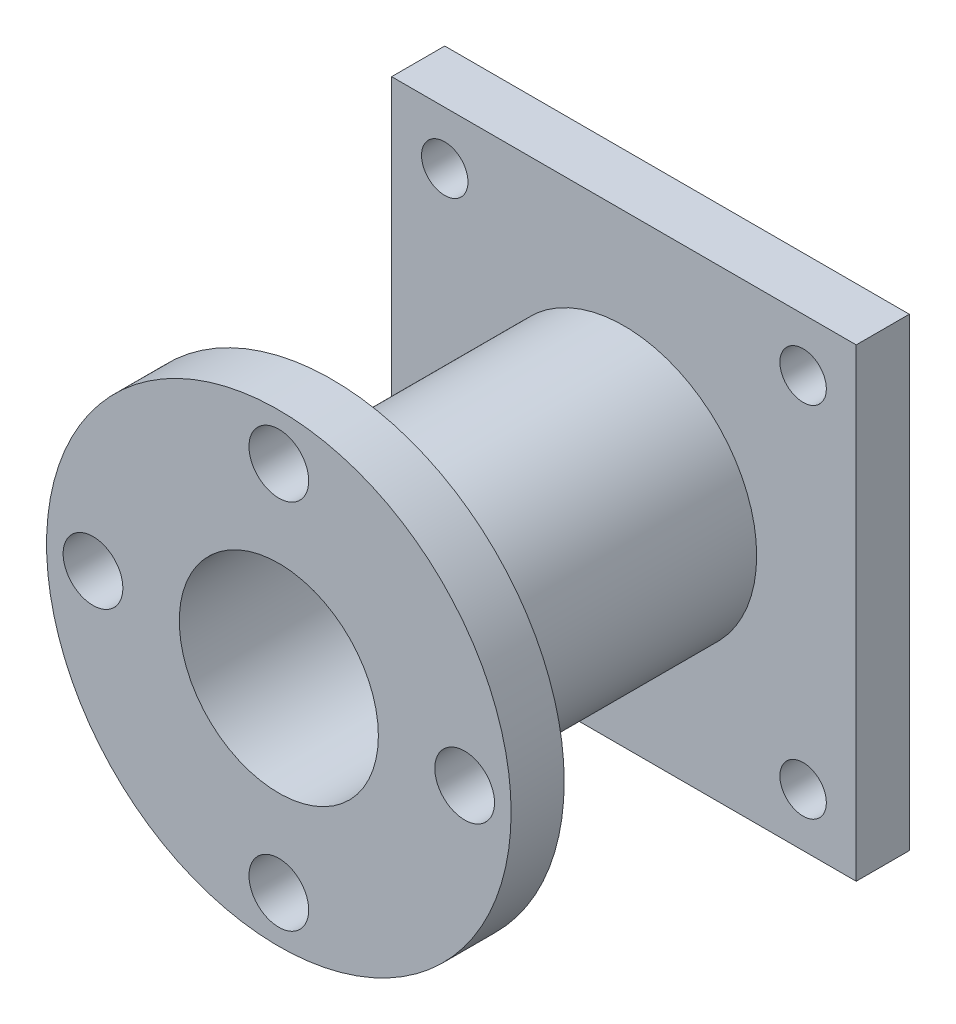
ISO-10303-21;
HEADER;
FILE_DESCRIPTION(('STEP AP214'),'2;1');
FILE_NAME('part.step','',(''),(''),'','','');
FILE_SCHEMA(('AUTOMOTIVE_DESIGN { 1 0 10303 214 1 1 1 1 }'));
ENDSEC;
DATA;
#1=APPLICATION_CONTEXT('core data for automotive mechanical design processes');
#2=APPLICATION_PROTOCOL_DEFINITION('international standard','automotive_design',2000,#1);
#3=PRODUCT_CONTEXT('',#1,'mechanical');
#4=PRODUCT('Part','Part','',(#3));
#5=PRODUCT_RELATED_PRODUCT_CATEGORY('part','',(#4));
#6=PRODUCT_DEFINITION_FORMATION('','',#4);
#7=PRODUCT_DEFINITION_CONTEXT('part definition',#1,'design');
#8=PRODUCT_DEFINITION('design','',#6,#7);
#9=PRODUCT_DEFINITION_SHAPE('','',#8);
#10=(LENGTH_UNIT() NAMED_UNIT(*) SI_UNIT(.MILLI.,.METRE.));
#11=(NAMED_UNIT(*) PLANE_ANGLE_UNIT() SI_UNIT($,.RADIAN.));
#12=(NAMED_UNIT(*) SI_UNIT($,.STERADIAN.) SOLID_ANGLE_UNIT());
#13=UNCERTAINTY_MEASURE_WITH_UNIT(LENGTH_MEASURE(1.E-05),#10,'distance_accuracy_value','');
#14=(GEOMETRIC_REPRESENTATION_CONTEXT(3) GLOBAL_UNCERTAINTY_ASSIGNED_CONTEXT((#13)) GLOBAL_UNIT_ASSIGNED_CONTEXT((#10,
#11,#12)) REPRESENTATION_CONTEXT('',''));
#15=CARTESIAN_POINT('',(0.,0.,0.));
#16=DIRECTION('',(0.,0.,1.));
#17=DIRECTION('',(1.,0.,0.));
#18=AXIS2_PLACEMENT_3D('',#15,#16,#17);
#19=CARTESIAN_POINT('',(0.,0.,60.));
#20=DIRECTION('',(0.,0.,-1.));
#21=DIRECTION('',(-1.,0.,0.));
#22=AXIS2_PLACEMENT_3D('',#19,#20,#21);
#23=CYLINDRICAL_SURFACE('',#22,20.);
#24=CARTESIAN_POINT('',(0.,0.,8.));
#25=DIRECTION('',(0.,0.,1.));
#26=DIRECTION('',(1.,0.,0.));
#27=AXIS2_PLACEMENT_3D('',#24,#25,#26);
#28=CIRCLE('',#27,20.);
#29=CARTESIAN_POINT('',(20.,0.,8.));
#30=VERTEX_POINT('',#29);
#31=EDGE_CURVE('E62',#30,#30,#28,.T.);
#32=ORIENTED_EDGE('',*,*,#31,.T.);
#33=EDGE_LOOP('',(#32));
#34=FACE_BOUND('',#33,.T.);
#35=CARTESIAN_POINT('',(0.,0.,52.));
#36=DIRECTION('',(0.,0.,1.));
#37=DIRECTION('',(1.,0.,0.));
#38=AXIS2_PLACEMENT_3D('',#35,#36,#37);
#39=CIRCLE('',#38,20.);
#40=CARTESIAN_POINT('',(20.,0.,52.));
#41=VERTEX_POINT('',#40);
#42=EDGE_CURVE('E11',#41,#41,#39,.T.);
#43=ORIENTED_EDGE('',*,*,#42,.F.);
#44=EDGE_LOOP('',(#43));
#45=FACE_BOUND('',#44,.T.);
#46=ADVANCED_FACE('F51',(#34,#45),#23,.T.);
#47=CARTESIAN_POINT('',(-35.,35.,8.));
#48=DIRECTION('',(1.,0.,0.));
#49=DIRECTION('',(0.,0.,-1.));
#50=AXIS2_PLACEMENT_3D('',#47,#48,#49);
#51=PLANE('',#50);
#52=DIRECTION('',(0.,-1.,0.));
#53=VECTOR('',#52,1.);
#54=CARTESIAN_POINT('',(-35.,35.,0.));
#55=LINE('',#54,#53);
#56=CARTESIAN_POINT('',(-35.,35.,0.));
#57=VERTEX_POINT('',#56);
#58=CARTESIAN_POINT('',(-35.,-35.,0.));
#59=VERTEX_POINT('',#58);
#60=EDGE_CURVE('E127',#57,#59,#55,.T.);
#61=ORIENTED_EDGE('',*,*,#60,.T.);
#62=DIRECTION('',(0.,0.,-1.));
#63=VECTOR('',#62,1.);
#64=CARTESIAN_POINT('',(-35.,-35.,8.));
#65=LINE('',#64,#63);
#66=CARTESIAN_POINT('',(-35.,-35.,8.));
#67=VERTEX_POINT('',#66);
#68=EDGE_CURVE('E114',#67,#59,#65,.T.);
#69=ORIENTED_EDGE('',*,*,#68,.F.);
#70=DIRECTION('',(0.,-1.,0.));
#71=VECTOR('',#70,1.);
#72=CARTESIAN_POINT('',(-35.,35.,8.));
#73=LINE('',#72,#71);
#74=CARTESIAN_POINT('',(-35.,35.,8.));
#75=VERTEX_POINT('',#74);
#76=EDGE_CURVE('E106',#75,#67,#73,.T.);
#77=ORIENTED_EDGE('',*,*,#76,.F.);
#78=DIRECTION('',(0.,0.,-1.));
#79=VECTOR('',#78,1.);
#80=CARTESIAN_POINT('',(-35.,35.,8.));
#81=LINE('',#80,#79);
#82=EDGE_CURVE('E123',#75,#57,#81,.T.);
#83=ORIENTED_EDGE('',*,*,#82,.T.);
#84=EDGE_LOOP('',(#61,#69,#77,#83));
#85=FACE_BOUND('',#84,.T.);
#86=ADVANCED_FACE('F167',(#85),#51,.F.);
#87=CARTESIAN_POINT('',(-35.,-35.,8.));
#88=DIRECTION('',(0.,1.,0.));
#89=DIRECTION('',(0.,0.,1.));
#90=AXIS2_PLACEMENT_3D('',#87,#88,#89);
#91=PLANE('',#90);
#92=DIRECTION('',(1.,0.,0.));
#93=VECTOR('',#92,1.);
#94=CARTESIAN_POINT('',(-35.,-35.,0.));
#95=LINE('',#94,#93);
#96=CARTESIAN_POINT('',(35.,-35.,0.));
#97=VERTEX_POINT('',#96);
#98=EDGE_CURVE('E112',#59,#97,#95,.T.);
#99=ORIENTED_EDGE('',*,*,#98,.T.);
#100=DIRECTION('',(0.,0.,-1.));
#101=VECTOR('',#100,1.);
#102=CARTESIAN_POINT('',(35.,-35.,8.));
#103=LINE('',#102,#101);
#104=CARTESIAN_POINT('',(35.,-35.,8.));
#105=VERTEX_POINT('',#104);
#106=EDGE_CURVE('E110',#105,#97,#103,.T.);
#107=ORIENTED_EDGE('',*,*,#106,.F.);
#108=DIRECTION('',(1.,0.,0.));
#109=VECTOR('',#108,1.);
#110=CARTESIAN_POINT('',(-35.,-35.,8.));
#111=LINE('',#110,#109);
#112=EDGE_CURVE('E101',#67,#105,#111,.T.);
#113=ORIENTED_EDGE('',*,*,#112,.F.);
#114=ORIENTED_EDGE('',*,*,#68,.T.);
#115=EDGE_LOOP('',(#99,#107,#113,#114));
#116=FACE_BOUND('',#115,.T.);
#117=ADVANCED_FACE('F111',(#116),#91,.F.);
#118=CARTESIAN_POINT('',(35.,-35.,8.));
#119=DIRECTION('',(-1.,0.,0.));
#120=DIRECTION('',(0.,0.,1.));
#121=AXIS2_PLACEMENT_3D('',#118,#119,#120);
#122=PLANE('',#121);
#123=DIRECTION('',(0.,1.,0.));
#124=VECTOR('',#123,1.);
#125=CARTESIAN_POINT('',(35.,-35.,0.));
#126=LINE('',#125,#124);
#127=CARTESIAN_POINT('',(35.,35.,0.));
#128=VERTEX_POINT('',#127);
#129=EDGE_CURVE('E87',#97,#128,#126,.T.);
#130=ORIENTED_EDGE('',*,*,#129,.T.);
#131=DIRECTION('',(0.,0.,-1.));
#132=VECTOR('',#131,1.);
#133=CARTESIAN_POINT('',(35.,35.,8.));
#134=LINE('',#133,#132);
#135=CARTESIAN_POINT('',(35.,35.,8.));
#136=VERTEX_POINT('',#135);
#137=EDGE_CURVE('E115',#136,#128,#134,.T.);
#138=ORIENTED_EDGE('',*,*,#137,.F.);
#139=DIRECTION('',(0.,1.,0.));
#140=VECTOR('',#139,1.);
#141=CARTESIAN_POINT('',(35.,-35.,8.));
#142=LINE('',#141,#140);
#143=EDGE_CURVE('E104',#105,#136,#142,.T.);
#144=ORIENTED_EDGE('',*,*,#143,.F.);
#145=ORIENTED_EDGE('',*,*,#106,.T.);
#146=EDGE_LOOP('',(#130,#138,#144,#145));
#147=FACE_BOUND('',#146,.T.);
#148=ADVANCED_FACE('F117',(#147),#122,.F.);
#149=CARTESIAN_POINT('',(35.,35.,8.));
#150=DIRECTION('',(0.,-1.,0.));
#151=DIRECTION('',(0.,0.,-1.));
#152=AXIS2_PLACEMENT_3D('',#149,#150,#151);
#153=PLANE('',#152);
#154=DIRECTION('',(-1.,0.,0.));
#155=VECTOR('',#154,1.);
#156=CARTESIAN_POINT('',(35.,35.,0.));
#157=LINE('',#156,#155);
#158=EDGE_CURVE('E93',#128,#57,#157,.T.);
#159=ORIENTED_EDGE('',*,*,#158,.T.);
#160=ORIENTED_EDGE('',*,*,#82,.F.);
#161=DIRECTION('',(-1.,0.,0.));
#162=VECTOR('',#161,1.);
#163=CARTESIAN_POINT('',(35.,35.,8.));
#164=LINE('',#163,#162);
#165=EDGE_CURVE('E70',#136,#75,#164,.T.);
#166=ORIENTED_EDGE('',*,*,#165,.F.);
#167=ORIENTED_EDGE('',*,*,#137,.T.);
#168=EDGE_LOOP('',(#159,#160,#166,#167));
#169=FACE_BOUND('',#168,.T.);
#170=ADVANCED_FACE('F153',(#169),#153,.F.);
#171=CARTESIAN_POINT('',(0.,0.,8.));
#172=DIRECTION('',(0.,0.,1.));
#173=DIRECTION('',(1.,0.,0.));
#174=AXIS2_PLACEMENT_3D('',#171,#172,#173);
#175=PLANE('',#174);
#176=CARTESIAN_POINT('',(27.,-27.,8.));
#177=DIRECTION('',(0.,0.,1.));
#178=DIRECTION('',(1.,0.,0.));
#179=AXIS2_PLACEMENT_3D('',#176,#177,#178);
#180=CIRCLE('',#179,3.5);
#181=CARTESIAN_POINT('',(30.5,-27.,8.));
#182=VERTEX_POINT('',#181);
#183=EDGE_CURVE('E250',#182,#182,#180,.T.);
#184=ORIENTED_EDGE('',*,*,#183,.F.);
#185=EDGE_LOOP('',(#184));
#186=FACE_BOUND('',#185,.T.);
#187=CARTESIAN_POINT('',(-27.,-27.,8.));
#188=DIRECTION('',(0.,0.,1.));
#189=DIRECTION('',(1.,0.,0.));
#190=AXIS2_PLACEMENT_3D('',#187,#188,#189);
#191=CIRCLE('',#190,3.5);
#192=CARTESIAN_POINT('',(-23.5,-27.,8.));
#193=VERTEX_POINT('',#192);
#194=EDGE_CURVE('E288',#193,#193,#191,.T.);
#195=ORIENTED_EDGE('',*,*,#194,.F.);
#196=EDGE_LOOP('',(#195));
#197=FACE_BOUND('',#196,.T.);
#198=CARTESIAN_POINT('',(-27.,27.,8.));
#199=DIRECTION('',(0.,0.,1.));
#200=DIRECTION('',(1.,0.,0.));
#201=AXIS2_PLACEMENT_3D('',#198,#199,#200);
#202=CIRCLE('',#201,3.5);
#203=CARTESIAN_POINT('',(-23.5,27.,8.));
#204=VERTEX_POINT('',#203);
#205=EDGE_CURVE('E280',#204,#204,#202,.T.);
#206=ORIENTED_EDGE('',*,*,#205,.F.);
#207=EDGE_LOOP('',(#206));
#208=FACE_BOUND('',#207,.T.);
#209=CARTESIAN_POINT('',(27.,27.,8.));
#210=DIRECTION('',(0.,0.,1.));
#211=DIRECTION('',(1.,0.,0.));
#212=AXIS2_PLACEMENT_3D('',#209,#210,#211);
#213=CIRCLE('',#212,3.5);
#214=CARTESIAN_POINT('',(30.5,27.,8.));
#215=VERTEX_POINT('',#214);
#216=EDGE_CURVE('E297',#215,#215,#213,.T.);
#217=ORIENTED_EDGE('',*,*,#216,.F.);
#218=EDGE_LOOP('',(#217));
#219=FACE_BOUND('',#218,.T.);
#220=ORIENTED_EDGE('',*,*,#31,.F.);
#221=EDGE_LOOP('',(#220));
#222=FACE_BOUND('',#221,.T.);
#223=ORIENTED_EDGE('',*,*,#76,.T.);
#224=ORIENTED_EDGE('',*,*,#112,.T.);
#225=ORIENTED_EDGE('',*,*,#143,.T.);
#226=ORIENTED_EDGE('',*,*,#165,.T.);
#227=EDGE_LOOP('',(#223,#224,#225,#226));
#228=FACE_BOUND('',#227,.T.);
#229=ADVANCED_FACE('F102',(#186,#197,#208,#219,#222,#228),#175,.T.);
#230=CARTESIAN_POINT('',(0.,0.,0.));
#231=DIRECTION('',(0.,0.,1.));
#232=DIRECTION('',(1.,0.,0.));
#233=AXIS2_PLACEMENT_3D('',#230,#231,#232);
#234=PLANE('',#233);
#235=CARTESIAN_POINT('',(27.,-27.,0.));
#236=DIRECTION('',(0.,0.,1.));
#237=DIRECTION('',(1.,0.,0.));
#238=AXIS2_PLACEMENT_3D('',#235,#236,#237);
#239=CIRCLE('',#238,3.5);
#240=CARTESIAN_POINT('',(30.5,-27.,0.));
#241=VERTEX_POINT('',#240);
#242=EDGE_CURVE('E292',#241,#241,#239,.T.);
#243=ORIENTED_EDGE('',*,*,#242,.T.);
#244=EDGE_LOOP('',(#243));
#245=FACE_BOUND('',#244,.T.);
#246=CARTESIAN_POINT('',(-27.,-27.,0.));
#247=DIRECTION('',(0.,0.,1.));
#248=DIRECTION('',(1.,0.,0.));
#249=AXIS2_PLACEMENT_3D('',#246,#247,#248);
#250=CIRCLE('',#249,3.5);
#251=CARTESIAN_POINT('',(-23.5,-27.,0.));
#252=VERTEX_POINT('',#251);
#253=EDGE_CURVE('E284',#252,#252,#250,.T.);
#254=ORIENTED_EDGE('',*,*,#253,.T.);
#255=EDGE_LOOP('',(#254));
#256=FACE_BOUND('',#255,.T.);
#257=CARTESIAN_POINT('',(-27.,27.,0.));
#258=DIRECTION('',(0.,0.,1.));
#259=DIRECTION('',(1.,0.,0.));
#260=AXIS2_PLACEMENT_3D('',#257,#258,#259);
#261=CIRCLE('',#260,3.5);
#262=CARTESIAN_POINT('',(-23.5,27.,0.));
#263=VERTEX_POINT('',#262);
#264=EDGE_CURVE('E276',#263,#263,#261,.T.);
#265=ORIENTED_EDGE('',*,*,#264,.T.);
#266=EDGE_LOOP('',(#265));
#267=FACE_BOUND('',#266,.T.);
#268=CARTESIAN_POINT('',(27.,27.,0.));
#269=DIRECTION('',(0.,0.,1.));
#270=DIRECTION('',(1.,0.,0.));
#271=AXIS2_PLACEMENT_3D('',#268,#269,#270);
#272=CIRCLE('',#271,3.5);
#273=CARTESIAN_POINT('',(30.5,27.,0.));
#274=VERTEX_POINT('',#273);
#275=EDGE_CURVE('E279',#274,#274,#272,.T.);
#276=ORIENTED_EDGE('',*,*,#275,.T.);
#277=EDGE_LOOP('',(#276));
#278=FACE_BOUND('',#277,.T.);
#279=CARTESIAN_POINT('',(0.,0.,0.));
#280=DIRECTION('',(0.,0.,1.));
#281=DIRECTION('',(1.,0.,0.));
#282=AXIS2_PLACEMENT_3D('',#279,#280,#281);
#283=CIRCLE('',#282,15.);
#284=CARTESIAN_POINT('',(15.,0.,0.));
#285=VERTEX_POINT('',#284);
#286=EDGE_CURVE('E303',#285,#285,#283,.T.);
#287=ORIENTED_EDGE('',*,*,#286,.T.);
#288=EDGE_LOOP('',(#287));
#289=FACE_BOUND('',#288,.T.);
#290=ORIENTED_EDGE('',*,*,#60,.F.);
#291=ORIENTED_EDGE('',*,*,#158,.F.);
#292=ORIENTED_EDGE('',*,*,#129,.F.);
#293=ORIENTED_EDGE('',*,*,#98,.F.);
#294=EDGE_LOOP('',(#290,#291,#292,#293));
#295=FACE_BOUND('',#294,.T.);
#296=ADVANCED_FACE('F152',(#245,#256,#267,#278,#289,#295),#234,.F.);
#297=CARTESIAN_POINT('',(0.,0.,60.));
#298=DIRECTION('',(0.,0.,-1.));
#299=DIRECTION('',(-1.,0.,0.));
#300=AXIS2_PLACEMENT_3D('',#297,#298,#299);
#301=CYLINDRICAL_SURFACE('',#300,35.);
#302=CARTESIAN_POINT('',(0.,0.,60.));
#303=DIRECTION('',(0.,0.,1.));
#304=DIRECTION('',(1.,0.,0.));
#305=AXIS2_PLACEMENT_3D('',#302,#303,#304);
#306=CIRCLE('',#305,35.);
#307=CARTESIAN_POINT('',(35.,0.,60.));
#308=VERTEX_POINT('',#307);
#309=EDGE_CURVE('E131',#308,#308,#306,.T.);
#310=ORIENTED_EDGE('',*,*,#309,.F.);
#311=EDGE_LOOP('',(#310));
#312=FACE_BOUND('',#311,.T.);
#313=CARTESIAN_POINT('',(0.,0.,52.));
#314=DIRECTION('',(0.,0.,1.));
#315=DIRECTION('',(1.,0.,0.));
#316=AXIS2_PLACEMENT_3D('',#313,#314,#315);
#317=CIRCLE('',#316,35.);
#318=CARTESIAN_POINT('',(35.,0.,52.));
#319=VERTEX_POINT('',#318);
#320=EDGE_CURVE('E307',#319,#319,#317,.T.);
#321=ORIENTED_EDGE('',*,*,#320,.T.);
#322=EDGE_LOOP('',(#321));
#323=FACE_BOUND('',#322,.T.);
#324=ADVANCED_FACE('F159',(#312,#323),#301,.T.);
#325=CARTESIAN_POINT('',(0.,0.,52.));
#326=DIRECTION('',(0.,0.,1.));
#327=DIRECTION('',(1.,0.,0.));
#328=AXIS2_PLACEMENT_3D('',#325,#326,#327);
#329=PLANE('',#328);
#330=CARTESIAN_POINT('',(28.,0.,52.));
#331=DIRECTION('',(0.,0.,1.));
#332=DIRECTION('',(1.,0.,0.));
#333=AXIS2_PLACEMENT_3D('',#330,#331,#332);
#334=CIRCLE('',#333,4.5);
#335=CARTESIAN_POINT('',(32.5,0.,52.));
#336=VERTEX_POINT('',#335);
#337=EDGE_CURVE('E240',#336,#336,#334,.T.);
#338=ORIENTED_EDGE('',*,*,#337,.T.);
#339=EDGE_LOOP('',(#338));
#340=FACE_BOUND('',#339,.T.);
#341=CARTESIAN_POINT('',(0.,28.,52.));
#342=DIRECTION('',(0.,0.,1.));
#343=DIRECTION('',(1.,0.,0.));
#344=AXIS2_PLACEMENT_3D('',#341,#342,#343);
#345=CIRCLE('',#344,4.5);
#346=CARTESIAN_POINT('',(4.5,28.,52.));
#347=VERTEX_POINT('',#346);
#348=EDGE_CURVE('E254',#347,#347,#345,.T.);
#349=ORIENTED_EDGE('',*,*,#348,.T.);
#350=EDGE_LOOP('',(#349));
#351=FACE_BOUND('',#350,.T.);
#352=CARTESIAN_POINT('',(-28.,0.,52.));
#353=DIRECTION('',(0.,0.,1.));
#354=DIRECTION('',(1.,0.,0.));
#355=AXIS2_PLACEMENT_3D('',#352,#353,#354);
#356=CIRCLE('',#355,4.5);
#357=CARTESIAN_POINT('',(-23.5,0.,52.));
#358=VERTEX_POINT('',#357);
#359=EDGE_CURVE('E264',#358,#358,#356,.T.);
#360=ORIENTED_EDGE('',*,*,#359,.T.);
#361=EDGE_LOOP('',(#360));
#362=FACE_BOUND('',#361,.T.);
#363=CARTESIAN_POINT('',(0.,-28.,52.));
#364=DIRECTION('',(0.,0.,1.));
#365=DIRECTION('',(1.,0.,0.));
#366=AXIS2_PLACEMENT_3D('',#363,#364,#365);
#367=CIRCLE('',#366,4.5);
#368=CARTESIAN_POINT('',(4.5,-28.,52.));
#369=VERTEX_POINT('',#368);
#370=EDGE_CURVE('E272',#369,#369,#367,.T.);
#371=ORIENTED_EDGE('',*,*,#370,.T.);
#372=EDGE_LOOP('',(#371));
#373=FACE_BOUND('',#372,.T.);
#374=ORIENTED_EDGE('',*,*,#42,.T.);
#375=EDGE_LOOP('',(#374));
#376=FACE_BOUND('',#375,.T.);
#377=ORIENTED_EDGE('',*,*,#320,.F.);
#378=EDGE_LOOP('',(#377));
#379=FACE_BOUND('',#378,.T.);
#380=ADVANCED_FACE('F185',(#340,#351,#362,#373,#376,#379),#329,.F.);
#381=CARTESIAN_POINT('',(0.,0.,60.));
#382=DIRECTION('',(0.,0.,1.));
#383=DIRECTION('',(1.,0.,0.));
#384=AXIS2_PLACEMENT_3D('',#381,#382,#383);
#385=PLANE('',#384);
#386=CARTESIAN_POINT('',(28.,0.,60.));
#387=DIRECTION('',(0.,0.,1.));
#388=DIRECTION('',(1.,0.,0.));
#389=AXIS2_PLACEMENT_3D('',#386,#387,#388);
#390=CIRCLE('',#389,4.5);
#391=CARTESIAN_POINT('',(32.5,0.,60.));
#392=VERTEX_POINT('',#391);
#393=EDGE_CURVE('E243',#392,#392,#390,.T.);
#394=ORIENTED_EDGE('',*,*,#393,.F.);
#395=EDGE_LOOP('',(#394));
#396=FACE_BOUND('',#395,.T.);
#397=CARTESIAN_POINT('',(0.,28.,60.));
#398=DIRECTION('',(0.,0.,1.));
#399=DIRECTION('',(1.,0.,0.));
#400=AXIS2_PLACEMENT_3D('',#397,#398,#399);
#401=CIRCLE('',#400,4.5);
#402=CARTESIAN_POINT('',(4.5,28.,60.));
#403=VERTEX_POINT('',#402);
#404=EDGE_CURVE('E245',#403,#403,#401,.T.);
#405=ORIENTED_EDGE('',*,*,#404,.F.);
#406=EDGE_LOOP('',(#405));
#407=FACE_BOUND('',#406,.T.);
#408=CARTESIAN_POINT('',(-28.,0.,60.));
#409=DIRECTION('',(0.,0.,1.));
#410=DIRECTION('',(1.,0.,0.));
#411=AXIS2_PLACEMENT_3D('',#408,#409,#410);
#412=CIRCLE('',#411,4.5);
#413=CARTESIAN_POINT('',(-23.5,0.,60.));
#414=VERTEX_POINT('',#413);
#415=EDGE_CURVE('E260',#414,#414,#412,.T.);
#416=ORIENTED_EDGE('',*,*,#415,.F.);
#417=EDGE_LOOP('',(#416));
#418=FACE_BOUND('',#417,.T.);
#419=CARTESIAN_POINT('',(0.,-28.,60.));
#420=DIRECTION('',(0.,0.,1.));
#421=DIRECTION('',(1.,0.,0.));
#422=AXIS2_PLACEMENT_3D('',#419,#420,#421);
#423=CIRCLE('',#422,4.5);
#424=CARTESIAN_POINT('',(4.5,-28.,60.));
#425=VERTEX_POINT('',#424);
#426=EDGE_CURVE('E268',#425,#425,#423,.T.);
#427=ORIENTED_EDGE('',*,*,#426,.F.);
#428=EDGE_LOOP('',(#427));
#429=FACE_BOUND('',#428,.T.);
#430=CARTESIAN_POINT('',(0.,0.,60.));
#431=DIRECTION('',(0.,0.,1.));
#432=DIRECTION('',(1.,0.,0.));
#433=AXIS2_PLACEMENT_3D('',#430,#431,#432);
#434=CIRCLE('',#433,15.);
#435=CARTESIAN_POINT('',(15.,0.,60.));
#436=VERTEX_POINT('',#435);
#437=EDGE_CURVE('E55',#436,#436,#434,.T.);
#438=ORIENTED_EDGE('',*,*,#437,.F.);
#439=EDGE_LOOP('',(#438));
#440=FACE_BOUND('',#439,.T.);
#441=ORIENTED_EDGE('',*,*,#309,.T.);
#442=EDGE_LOOP('',(#441));
#443=FACE_BOUND('',#442,.T.);
#444=ADVANCED_FACE('F180',(#396,#407,#418,#429,#440,#443),#385,.T.);
#445=CARTESIAN_POINT('',(0.,0.,-71.));
#446=DIRECTION('',(0.,0.,1.));
#447=DIRECTION('',(1.,0.,0.));
#448=AXIS2_PLACEMENT_3D('',#445,#446,#447);
#449=CYLINDRICAL_SURFACE('',#448,15.);
#450=ORIENTED_EDGE('',*,*,#437,.T.);
#451=EDGE_LOOP('',(#450));
#452=FACE_BOUND('',#451,.T.);
#453=ORIENTED_EDGE('',*,*,#286,.F.);
#454=EDGE_LOOP('',(#453));
#455=FACE_BOUND('',#454,.T.);
#456=ADVANCED_FACE('F184',(#452,#455),#449,.F.);
#457=CARTESIAN_POINT('',(27.,27.,8.));
#458=DIRECTION('',(0.,0.,-1.));
#459=DIRECTION('',(-1.,0.,0.));
#460=AXIS2_PLACEMENT_3D('',#457,#458,#459);
#461=CYLINDRICAL_SURFACE('',#460,3.5);
#462=ORIENTED_EDGE('',*,*,#216,.T.);
#463=EDGE_LOOP('',(#462));
#464=FACE_BOUND('',#463,.T.);
#465=ORIENTED_EDGE('',*,*,#275,.F.);
#466=EDGE_LOOP('',(#465));
#467=FACE_BOUND('',#466,.T.);
#468=ADVANCED_FACE('F197',(#464,#467),#461,.F.);
#469=CARTESIAN_POINT('',(-27.,27.,8.));
#470=DIRECTION('',(0.,0.,-1.));
#471=DIRECTION('',(-1.,0.,0.));
#472=AXIS2_PLACEMENT_3D('',#469,#470,#471);
#473=CYLINDRICAL_SURFACE('',#472,3.5);
#474=ORIENTED_EDGE('',*,*,#205,.T.);
#475=EDGE_LOOP('',(#474));
#476=FACE_BOUND('',#475,.T.);
#477=ORIENTED_EDGE('',*,*,#264,.F.);
#478=EDGE_LOOP('',(#477));
#479=FACE_BOUND('',#478,.T.);
#480=ADVANCED_FACE('F202',(#476,#479),#473,.F.);
#481=CARTESIAN_POINT('',(-27.,-27.,8.));
#482=DIRECTION('',(0.,0.,-1.));
#483=DIRECTION('',(-1.,0.,0.));
#484=AXIS2_PLACEMENT_3D('',#481,#482,#483);
#485=CYLINDRICAL_SURFACE('',#484,3.5);
#486=ORIENTED_EDGE('',*,*,#194,.T.);
#487=EDGE_LOOP('',(#486));
#488=FACE_BOUND('',#487,.T.);
#489=ORIENTED_EDGE('',*,*,#253,.F.);
#490=EDGE_LOOP('',(#489));
#491=FACE_BOUND('',#490,.T.);
#492=ADVANCED_FACE('F210',(#488,#491),#485,.F.);
#493=CARTESIAN_POINT('',(27.,-27.,8.));
#494=DIRECTION('',(0.,0.,-1.));
#495=DIRECTION('',(-1.,0.,0.));
#496=AXIS2_PLACEMENT_3D('',#493,#494,#495);
#497=CYLINDRICAL_SURFACE('',#496,3.5);
#498=ORIENTED_EDGE('',*,*,#183,.T.);
#499=EDGE_LOOP('',(#498));
#500=FACE_BOUND('',#499,.T.);
#501=ORIENTED_EDGE('',*,*,#242,.F.);
#502=EDGE_LOOP('',(#501));
#503=FACE_BOUND('',#502,.T.);
#504=ADVANCED_FACE('F205',(#500,#503),#497,.F.);
#505=CARTESIAN_POINT('',(0.,-28.,52.));
#506=DIRECTION('',(0.,0.,1.));
#507=DIRECTION('',(1.,0.,0.));
#508=AXIS2_PLACEMENT_3D('',#505,#506,#507);
#509=CYLINDRICAL_SURFACE('',#508,4.5);
#510=ORIENTED_EDGE('',*,*,#370,.F.);
#511=EDGE_LOOP('',(#510));
#512=FACE_BOUND('',#511,.T.);
#513=ORIENTED_EDGE('',*,*,#426,.T.);
#514=EDGE_LOOP('',(#513));
#515=FACE_BOUND('',#514,.T.);
#516=ADVANCED_FACE('F209',(#512,#515),#509,.F.);
#517=CARTESIAN_POINT('',(-28.,0.,52.));
#518=DIRECTION('',(0.,0.,1.));
#519=DIRECTION('',(1.,0.,0.));
#520=AXIS2_PLACEMENT_3D('',#517,#518,#519);
#521=CYLINDRICAL_SURFACE('',#520,4.5);
#522=ORIENTED_EDGE('',*,*,#359,.F.);
#523=EDGE_LOOP('',(#522));
#524=FACE_BOUND('',#523,.T.);
#525=ORIENTED_EDGE('',*,*,#415,.T.);
#526=EDGE_LOOP('',(#525));
#527=FACE_BOUND('',#526,.T.);
#528=ADVANCED_FACE('F222',(#524,#527),#521,.F.);
#529=CARTESIAN_POINT('',(0.,28.,52.));
#530=DIRECTION('',(0.,0.,1.));
#531=DIRECTION('',(1.,0.,0.));
#532=AXIS2_PLACEMENT_3D('',#529,#530,#531);
#533=CYLINDRICAL_SURFACE('',#532,4.5);
#534=ORIENTED_EDGE('',*,*,#348,.F.);
#535=EDGE_LOOP('',(#534));
#536=FACE_BOUND('',#535,.T.);
#537=ORIENTED_EDGE('',*,*,#404,.T.);
#538=EDGE_LOOP('',(#537));
#539=FACE_BOUND('',#538,.T.);
#540=ADVANCED_FACE('F227',(#536,#539),#533,.F.);
#541=CARTESIAN_POINT('',(28.,0.,52.));
#542=DIRECTION('',(0.,0.,1.));
#543=DIRECTION('',(1.,0.,0.));
#544=AXIS2_PLACEMENT_3D('',#541,#542,#543);
#545=CYLINDRICAL_SURFACE('',#544,4.5);
#546=ORIENTED_EDGE('',*,*,#337,.F.);
#547=EDGE_LOOP('',(#546));
#548=FACE_BOUND('',#547,.T.);
#549=ORIENTED_EDGE('',*,*,#393,.T.);
#550=EDGE_LOOP('',(#549));
#551=FACE_BOUND('',#550,.T.);
#552=ADVANCED_FACE('F232',(#548,#551),#545,.F.);
#553=CLOSED_SHELL('',(#46,#86,#117,#148,#170,#229,#296,#324,#380,#444,#456,#468,#480,#492,#504,
#516,#528,#540,#552));
#554=MANIFOLD_SOLID_BREP('B2',#553);
#555=ADVANCED_BREP_SHAPE_REPRESENTATION('',(#18,#554),#14);
#556=SHAPE_DEFINITION_REPRESENTATION(#9,#555);
ENDSEC;
END-ISO-10303-21;
